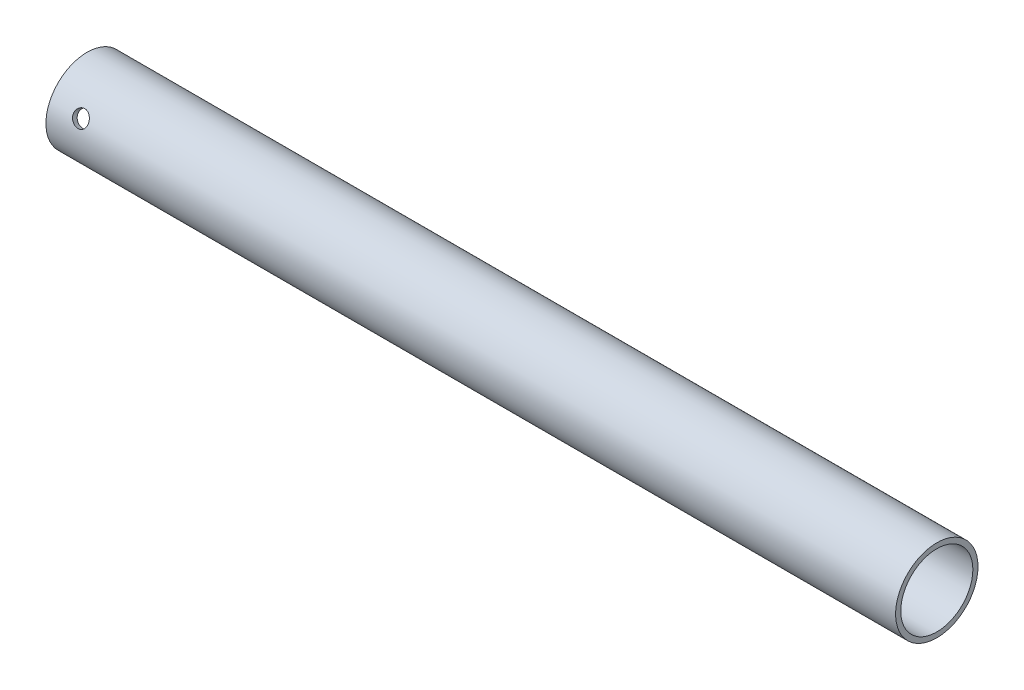
ISO-10303-21;
HEADER;
FILE_DESCRIPTION(('STEP AP214'),'2;1');
FILE_NAME('part.step','',(''),(''),'','','');
FILE_SCHEMA(('AUTOMOTIVE_DESIGN { 1 0 10303 214 1 1 1 1 }'));
ENDSEC;
DATA;
#1=APPLICATION_CONTEXT('core data for automotive mechanical design processes');
#2=APPLICATION_PROTOCOL_DEFINITION('international standard','automotive_design',2000,#1);
#3=PRODUCT_CONTEXT('',#1,'mechanical');
#4=PRODUCT('Part','Part','',(#3));
#5=PRODUCT_RELATED_PRODUCT_CATEGORY('part','',(#4));
#6=PRODUCT_DEFINITION_FORMATION('','',#4);
#7=PRODUCT_DEFINITION_CONTEXT('part definition',#1,'design');
#8=PRODUCT_DEFINITION('design','',#6,#7);
#9=PRODUCT_DEFINITION_SHAPE('','',#8);
#10=(LENGTH_UNIT() NAMED_UNIT(*) SI_UNIT(.MILLI.,.METRE.));
#11=(NAMED_UNIT(*) PLANE_ANGLE_UNIT() SI_UNIT($,.RADIAN.));
#12=(NAMED_UNIT(*) SI_UNIT($,.STERADIAN.) SOLID_ANGLE_UNIT());
#13=UNCERTAINTY_MEASURE_WITH_UNIT(LENGTH_MEASURE(1.E-05),#10,'distance_accuracy_value','');
#14=(GEOMETRIC_REPRESENTATION_CONTEXT(3) GLOBAL_UNCERTAINTY_ASSIGNED_CONTEXT((#13)) GLOBAL_UNIT_ASSIGNED_CONTEXT((#10,
#11,#12)) REPRESENTATION_CONTEXT('',''));
#15=CARTESIAN_POINT('',(0.,0.,0.));
#16=DIRECTION('',(0.,0.,1.));
#17=DIRECTION('',(1.,0.,0.));
#18=AXIS2_PLACEMENT_3D('',#15,#16,#17);
#19=CARTESIAN_POINT('',(0.,0.,0.));
#20=DIRECTION('',(1.,0.,0.));
#21=DIRECTION('',(0.,0.,-1.));
#22=AXIS2_PLACEMENT_3D('',#19,#20,#21);
#23=CYLINDRICAL_SURFACE('',#22,8.);
#24=CARTESIAN_POINT('',(6.00000000000021,-4.73293889927224,-6.44975110959761));
#25=CARTESIAN_POINT('',(5.91654279198847,-4.73293670356536,-6.44975394423419));
#26=CARTESIAN_POINT('',(5.83304405178182,-4.72720698252317,-6.45396938374698));
#27=CARTESIAN_POINT('',(5.66840103841831,-4.70440651115899,-6.47060669800228));
#28=CARTESIAN_POINT('',(5.58725882357274,-4.68732614014272,-6.48303553428556));
#29=CARTESIAN_POINT('',(5.42973492862934,-4.64222504081717,-6.5154057096328));
#30=CARTESIAN_POINT('',(5.35334889069292,-4.61421450352958,-6.53534005014052));
#31=CARTESIAN_POINT('',(5.2073464407134,-4.54786060870917,-6.58168627596715));
#32=CARTESIAN_POINT('',(5.13772950099691,-4.50951805747086,-6.6080976558134));
#33=CARTESIAN_POINT('',(5.00636980080108,-4.42281518271739,-6.66644275256281));
#34=CARTESIAN_POINT('',(4.94472351652848,-4.37434790440385,-6.698434772637));
#35=CARTESIAN_POINT('',(4.83189561040065,-4.26869189559974,-6.76625471572917));
#36=CARTESIAN_POINT('',(4.78071467557542,-4.21150259295507,-6.80208289034822));
#37=CARTESIAN_POINT('',(4.6899006233997,-4.08920330227158,-6.87630450779502));
#38=CARTESIAN_POINT('',(4.65035846648079,-4.02403628254782,-6.91471541668687));
#39=CARTESIAN_POINT('',(4.58453045772668,-3.88771533566696,-6.99226794903772));
#40=CARTESIAN_POINT('',(4.55824351600999,-3.81656190129141,-7.03140951214574));
#41=CARTESIAN_POINT('',(4.51997045138908,-3.6709983171679,-7.10847885261805));
#42=CARTESIAN_POINT('',(4.50782169407753,-3.59663562086913,-7.14641544929035));
#43=CARTESIAN_POINT('',(4.49766311229981,-3.44597163872381,-7.22027112025837));
#44=CARTESIAN_POINT('',(4.49965208386116,-3.36967051850532,-7.25619036608962));
#45=CARTESIAN_POINT('',(4.51758777114737,-3.21832575593646,-7.32456085190126));
#46=CARTESIAN_POINT('',(4.53335936943022,-3.14327833274643,-7.357049890991));
#47=CARTESIAN_POINT('',(4.57813564939545,-2.99568272204767,-7.41837420339098));
#48=CARTESIAN_POINT('',(4.60714081334602,-2.92313462572503,-7.44720934349396));
#49=CARTESIAN_POINT('',(4.67772773105852,-2.78230135720888,-7.50096781937475));
#50=CARTESIAN_POINT('',(4.71937948791271,-2.71404253304842,-7.52586817749739));
#51=CARTESIAN_POINT('',(4.81402566907737,-2.58429915522336,-7.57140228300957));
#52=CARTESIAN_POINT('',(4.8670212468878,-2.52281529143652,-7.59203559608348));
#53=CARTESIAN_POINT('',(4.98381570298375,-2.40764614162569,-7.6293490689533));
#54=CARTESIAN_POINT('',(5.04776778390229,-2.35409490186335,-7.64596375667763));
#55=CARTESIAN_POINT('',(5.18414953127884,-2.2577120085726,-7.67497737059568));
#56=CARTESIAN_POINT('',(5.25657932176485,-2.21488051190169,-7.68737623510198));
#57=CARTESIAN_POINT('',(5.40805827070288,-2.1413770156803,-7.70817573234633));
#58=CARTESIAN_POINT('',(5.48711845719086,-2.11072578100153,-7.7165695421267));
#59=CARTESIAN_POINT('',(5.64950118412342,-2.06284146749825,-7.72950880925701));
#60=CARTESIAN_POINT('',(5.732823240465,-2.04560686827817,-7.73405470266438));
#61=CARTESIAN_POINT('',(5.9000193288561,-2.02538440271331,-7.73937510637354));
#62=CARTESIAN_POINT('',(5.98386611556573,-2.02218573326198,-7.74020542402902));
#63=CARTESIAN_POINT('',(6.15090345508737,-2.02958374395865,-7.73826879419946));
#64=CARTESIAN_POINT('',(6.2340940401483,-2.04017974186624,-7.73550202461493));
#65=CARTESIAN_POINT('',(6.39675290305461,-2.07460949572077,-7.72633841028058));
#66=CARTESIAN_POINT('',(6.47624625262511,-2.09833317706915,-7.71997174085314));
#67=CARTESIAN_POINT('',(6.63005718973038,-2.15806845138347,-7.70348588657784));
#68=CARTESIAN_POINT('',(6.70437439531555,-2.1940809499915,-7.6933664251578));
#69=CARTESIAN_POINT('',(6.84666761904338,-2.27762631635789,-7.66904986300165));
#70=CARTESIAN_POINT('',(6.91456053786629,-2.32528736660282,-7.6548070419685));
#71=CARTESIAN_POINT('',(7.04121204021455,-2.43031872170758,-7.62211053765215));
#72=CARTESIAN_POINT('',(7.09996980155599,-2.48768989953044,-7.60365647571661));
#73=CARTESIAN_POINT('',(7.20748376353434,-2.61114263432655,-7.56215729468081));
#74=CARTESIAN_POINT('',(7.25609582660618,-2.67733033983387,-7.53905412262219));
#75=CARTESIAN_POINT('',(7.34092120617788,-2.81570946408062,-7.48847107999485));
#76=CARTESIAN_POINT('',(7.37713500002522,-2.88790065154611,-7.4609913779872));
#77=CARTESIAN_POINT('',(7.4359200978643,-3.03563966231636,-7.40210622595685));
#78=CARTESIAN_POINT('',(7.45856218756163,-3.11116782361979,-7.37072219461549));
#79=CARTESIAN_POINT('',(7.4897870482901,-3.26360346148095,-7.30450492677288));
#80=CARTESIAN_POINT('',(7.49837129866293,-3.34051079204405,-7.26967205361105));
#81=CARTESIAN_POINT('',(7.50118530151866,-3.49221274188924,-7.19801230574731));
#82=CARTESIAN_POINT('',(7.49563275312975,-3.567021680966,-7.16122411171047));
#83=CARTESIAN_POINT('',(7.47080757223178,-3.71362751529178,-7.08630715799654));
#84=CARTESIAN_POINT('',(7.45153507125601,-3.78542443941002,-7.04817841117467));
#85=CARTESIAN_POINT('',(7.3999087926165,-3.92399265047263,-6.97198164973479));
#86=CARTESIAN_POINT('',(7.36757818711921,-3.99077259259497,-6.93391364683718));
#87=CARTESIAN_POINT('',(7.29077954634503,-4.11783949333345,-6.85921544133708));
#88=CARTESIAN_POINT('',(7.24631069789356,-4.17812601655994,-6.8225853352514));
#89=CARTESIAN_POINT('',(7.14574854555789,-4.29167060045421,-6.75174876834537));
#90=CARTESIAN_POINT('',(7.08949796613851,-4.34481570836328,-6.71758450284534));
#91=CARTESIAN_POINT('',(6.96729543750751,-4.44190611067895,-6.65378489894142));
#92=CARTESIAN_POINT('',(6.9013412096265,-4.48584923833142,-6.62415062764003));
#93=CARTESIAN_POINT('',(6.76087354529687,-4.5639522587067,-6.57058670129395));
#94=CARTESIAN_POINT('',(6.68628656033258,-4.59801786912424,-6.54671236575887));
#95=CARTESIAN_POINT('',(6.53117421002048,-4.65504201593189,-6.50629046108281));
#96=CARTESIAN_POINT('',(6.45065453341083,-4.67801103690441,-6.48973597705864));
#97=CARTESIAN_POINT('',(6.3082477119343,-4.70771847740246,-6.468200584443));
#98=CARTESIAN_POINT('',(6.24719427623827,-4.71716388554578,-6.46130220512707));
#99=CARTESIAN_POINT('',(6.1241015315799,-4.72977482741939,-6.45207647594048));
#100=CARTESIAN_POINT('',(6.06206224949989,-4.73294053209117,-6.44974900164401));
#101=CARTESIAN_POINT('',(6.00000000000021,-4.73293889927224,-6.44975110959761));
#102=B_SPLINE_CURVE_WITH_KNOTS('',3,(#24,#25,#26,#27,#28,#29,#30,#31,#32,#33,#34,#35,#36,#37,
#38,#39,#40,#41,#42,#43,#44,#45,#46,#47,#48,#49,#50,#51,#52,#53,#54,#55,#56,#57,#58,#59,#60,#61,
#62,#63,#64,#65,#66,#67,#68,#69,#70,#71,#72,#73,#74,#75,#76,#77,#78,#79,#80,#81,#82,#83,#84,#85,
#86,#87,#88,#89,#90,#91,#92,#93,#94,#95,#96,#97,#98,#99,#100,#101),.UNSPECIFIED.,.T.,.F.,(4,2,2,
2,2,2,2,2,2,2,2,2,2,2,2,2,2,2,2,2,2,2,2,2,2,2,2,2,2,2,2,2,2,2,2,2,2,2,4),(0.,0.250144505793187,
0.500501302380396,0.750625227978438,1.00072963993909,1.25362335698692,1.50653367069315,
1.76137104348048,2.01618745939641,2.26804275460261,2.51987660200648,2.76855650598725,
3.01724547328425,3.2673369198422,3.51745380911786,3.77140614764065,4.02536220192401,
4.27974936118267,4.53410768866488,4.78463248587076,5.03514489338719,5.28358792315369,
5.53204926624318,5.78337862654144,6.03473059394678,6.28944125495871,6.54414210821706,
6.79750269418684,7.05083661667331,7.30029300570139,7.54974700322169,7.79876026530359,
8.04779021357111,8.30038464008746,8.55303847730766,8.80803001818119,9.0627801574912,
9.24880307527216,9.43482092920426),.UNSPECIFIED.);
#103=CARTESIAN_POINT('',(6.00000000000021,-4.73293889927224,-6.44975110959761));
#104=VERTEX_POINT('',#103);
#105=EDGE_CURVE('E74',#104,#104,#102,.T.);
#106=ORIENTED_EDGE('',*,*,#105,.F.);
#107=EDGE_LOOP('',(#106));
#108=FACE_BOUND('',#107,.T.);
#109=CARTESIAN_POINT('',(6.00000000000022,2.02439330337612,7.73962736527063));
#110=CARTESIAN_POINT('',(6.08345720801196,2.02439688800807,7.7396274471672));
#111=CARTESIAN_POINT('',(6.16695594821861,2.03128092762491,7.73783590256517));
#112=CARTESIAN_POINT('',(6.33159896158213,2.05856820133278,7.73062019652554));
#113=CARTESIAN_POINT('',(6.4127411764277,2.07898290383587,7.72519295347584));
#114=CARTESIAN_POINT('',(6.5702650713711,2.13254021942243,7.71057955689787));
#115=CARTESIAN_POINT('',(6.64665110930751,2.16567097589517,7.70139690444004));
#116=CARTESIAN_POINT('',(6.79265355928703,2.24347397071442,7.67909206184102));
#117=CARTESIAN_POINT('',(6.86227049900353,2.28814530844045,7.6659701791022));
#118=CARTESIAN_POINT('',(6.99363019919936,2.38808930052141,7.63542943169589));
#119=CARTESIAN_POINT('',(7.05527648347195,2.44347463051732,7.61796427676404));
#120=CARTESIAN_POINT('',(7.16810438959979,2.5627202685297,7.57868050540153));
#121=CARTESIAN_POINT('',(7.21928532442502,2.6265811324951,7.55686160334143));
#122=CARTESIAN_POINT('',(7.31009937660074,2.76128664904322,7.50869118908526));
#123=CARTESIAN_POINT('',(7.34964153351964,2.83218080725976,7.4823064072529));
#124=CARTESIAN_POINT('',(7.41546954227375,2.97830980619766,7.42534930495711));
#125=CARTESIAN_POINT('',(7.44175648399044,3.0535442894781,7.39477732903962));
#126=CARTESIAN_POINT('',(7.48002954861136,3.20512351589156,7.33033993008827));
#127=CARTESIAN_POINT('',(7.49217830592291,3.28144519758691,7.29651690729174));
#128=CARTESIAN_POINT('',(7.50233688770062,3.43374404318924,7.22609420301094));
#129=CARTESIAN_POINT('',(7.50034791613928,3.5097212358816,7.18949475823006));
#130=CARTESIAN_POINT('',(7.48241222885307,3.65819059557423,7.11508636005078));
#131=CARTESIAN_POINT('',(7.46664063057021,3.73071449182107,7.07729829498236));
#132=CARTESIAN_POINT('',(7.42186435060498,3.87135039534218,7.0013596471825));
#133=CARTESIAN_POINT('',(7.39285918665442,3.9394622417257,6.96320905128905));
#134=CARTESIAN_POINT('',(7.32227226894192,4.06996210919647,6.88775199171158));
#135=CARTESIAN_POINT('',(7.28062051208772,4.13231568460117,6.85045150184007));
#136=CARTESIAN_POINT('',(7.18597433092307,4.24944071855494,6.77842077731517));
#137=CARTESIAN_POINT('',(7.13297875311264,4.30421140510218,6.74369080452929));
#138=CARTESIAN_POINT('',(7.01618429701669,4.40576843084551,6.67779392411811));
#139=CARTESIAN_POINT('',(6.95223221609814,4.45241945368148,6.64668982154919));
#140=CARTESIAN_POINT('',(6.81585046872159,4.53569224268836,6.59014696592006));
#141=CARTESIAN_POINT('',(6.74342067823558,4.57231386210396,6.56470829576034));
#142=CARTESIAN_POINT('',(6.59194172929755,4.63478919500224,6.52075131882112));
#143=CARTESIAN_POINT('',(6.51288154280957,4.66062452381412,6.50224483306222));
#144=CARTESIAN_POINT('',(6.35049881587701,4.7008503420867,6.47322388101287));
#145=CARTESIAN_POINT('',(6.26717675953543,4.71524212835275,6.46270850915924));
#146=CARTESIAN_POINT('',(6.09998067114434,4.73211839059227,6.45036158314611));
#147=CARTESIAN_POINT('',(6.0161338844347,4.73477905708706,6.44840154042429));
#148=CARTESIAN_POINT('',(5.84909654491307,4.72861275442688,6.45292457136249));
#149=CARTESIAN_POINT('',(5.76590595985213,4.71978635338578,6.45940722747347));
#150=CARTESIAN_POINT('',(5.60324709694583,4.69097187652095,6.48036207658194));
#151=CARTESIAN_POINT('',(5.52375374737532,4.67107660489194,6.4947678290137));
#152=CARTESIAN_POINT('',(5.36994281027006,4.62062798786718,6.53075426296987));
#153=CARTESIAN_POINT('',(5.29562560468489,4.59007385694773,6.55233547329698));
#154=CARTESIAN_POINT('',(5.15333238095705,4.5185388629093,6.60187200591998));
#155=CARTESIAN_POINT('',(5.08543946213414,4.47744171398628,6.62989802975196));
#156=CARTESIAN_POINT('',(4.95878795978588,4.38585874581796,6.69083411832953));
#157=CARTESIAN_POINT('',(4.90003019844444,4.33537208239313,6.72374462216845));
#158=CARTESIAN_POINT('',(4.79251623646609,4.22534447347836,6.79343454275801));
#159=CARTESIAN_POINT('',(4.74390417339425,4.16569155477132,6.83025978151113));
#160=CARTESIAN_POINT('',(4.65907879382255,4.03920379092907,6.9058128875156));
#161=CARTESIAN_POINT('',(4.62286499997521,3.97236922242576,6.94454068145074));
#162=CARTESIAN_POINT('',(4.56407990213614,3.83353664176246,7.02212799342493));
#163=CARTESIAN_POINT('',(4.54143781243881,3.76156765092481,7.06098574594515));
#164=CARTESIAN_POINT('',(4.51021295171033,3.61408244938435,7.1375981834292));
#165=CARTESIAN_POINT('',(4.50162870133751,3.53856661278545,7.17535298404869));
#166=CARTESIAN_POINT('',(4.49881469848177,3.38731842666378,7.24796556729454));
#167=CARTESIAN_POINT('',(4.50436724687069,3.31160708250177,7.28285884675441));
#168=CARTESIAN_POINT('',(4.52919242776865,3.16104201589046,7.34946200980591));
#169=CARTESIAN_POINT('',(4.54846492874443,3.08618828522621,7.38117192391316));
#170=CARTESIAN_POINT('',(4.60009120738393,2.93969548796048,7.44072824952415));
#171=CARTESIAN_POINT('',(4.63242181288123,2.86805097535126,7.46858138808092));
#172=CARTESIAN_POINT('',(4.7092204536554,2.72997056154445,7.52015287721163));
#173=CARTESIAN_POINT('',(4.75368930210687,2.66353500969358,7.54387095059156));
#174=CARTESIAN_POINT('',(4.85425145444254,2.53697539993205,7.58737792612151));
#175=CARTESIAN_POINT('',(4.91050203386192,2.47695529226579,7.60710572902892));
#176=CARTESIAN_POINT('',(5.03270456249292,2.36622959900129,7.64227327843477));
#177=CARTESIAN_POINT('',(5.09865879037394,2.3155262075172,7.65771201528259));
#178=CARTESIAN_POINT('',(5.23912645470356,2.2247144361632,7.68458948132572));
#179=CARTESIAN_POINT('',(5.31371343966786,2.18470842838921,7.69598987835165));
#180=CARTESIAN_POINT('',(5.46882578997996,2.11738519900045,7.71478526293002));
#181=CARTESIAN_POINT('',(5.5493454665896,2.09005600071383,7.72218403220286));
#182=CARTESIAN_POINT('',(5.69175228806613,2.05461271821386,7.73167502170255));
#183=CARTESIAN_POINT('',(5.75280572376216,2.0433038209064,7.7346603548279));
#184=CARTESIAN_POINT('',(5.87589846842053,2.02819288281714,7.73863646901471));
#185=CARTESIAN_POINT('',(5.93793775050054,2.02439063769478,7.73962730436893));
#186=CARTESIAN_POINT('',(6.00000000000022,2.02439330337612,7.73962736527063));
#187=B_SPLINE_CURVE_WITH_KNOTS('',3,(#109,#110,#111,#112,#113,#114,#115,#116,#117,#118,#119,
#120,#121,#122,#123,#124,#125,#126,#127,#128,#129,#130,#131,#132,#133,#134,#135,#136,#137,#138,
#139,#140,#141,#142,#143,#144,#145,#146,#147,#148,#149,#150,#151,#152,#153,#154,#155,#156,#157,
#158,#159,#160,#161,#162,#163,#164,#165,#166,#167,#168,#169,#170,#171,#172,#173,#174,#175,#176,
#177,#178,#179,#180,#181,#182,#183,#184,#185,#186),.UNSPECIFIED.,.T.,.F.,(4,2,2,2,2,2,2,2,2,2,2,
2,2,2,2,2,2,2,2,2,2,2,2,2,2,2,2,2,2,2,2,2,2,2,2,2,2,2,4),(0.,0.250144505793187,
0.500501302380396,0.750625227978437,1.00072963993908,1.25362335698692,1.50653367069315,
1.76137104348048,2.01618745939641,2.26804275460261,2.51987660200649,2.76855650598725,
3.01724547328425,3.2673369198422,3.51745380911786,3.77140614764065,4.02536220192401,
4.27974936118267,4.53410768866489,4.78463248587076,5.03514489338719,5.28358792315369,
5.53204926624318,5.78337862654144,6.03473059394678,6.28944125495872,6.54414210821706,
6.79750269418684,7.05083661667331,7.30029300570139,7.54974700322169,7.79876026530359,
8.04779021357111,8.30038464008746,8.55303847730766,8.80803001818119,9.0627801574912,
9.24880307527216,9.43482092920426),.UNSPECIFIED.);
#188=CARTESIAN_POINT('',(6.00000000000022,2.02439330337612,7.73962736527063));
#189=VERTEX_POINT('',#188);
#190=EDGE_CURVE('E92',#189,#189,#187,.T.);
#191=ORIENTED_EDGE('',*,*,#190,.F.);
#192=EDGE_LOOP('',(#191));
#193=FACE_BOUND('',#192,.T.);
#194=CARTESIAN_POINT('',(165.,0.,0.));
#195=DIRECTION('',(1.,0.,0.));
#196=DIRECTION('',(0.,0.,-1.));
#197=AXIS2_PLACEMENT_3D('',#194,#195,#196);
#198=CIRCLE('',#197,8.);
#199=CARTESIAN_POINT('',(165.,0.,-8.));
#200=VERTEX_POINT('',#199);
#201=EDGE_CURVE('E66',#200,#200,#198,.T.);
#202=ORIENTED_EDGE('',*,*,#201,.F.);
#203=EDGE_LOOP('',(#202));
#204=FACE_BOUND('',#203,.T.);
#205=CARTESIAN_POINT('',(0.,0.,0.));
#206=DIRECTION('',(1.,0.,0.));
#207=DIRECTION('',(0.,0.,-1.));
#208=AXIS2_PLACEMENT_3D('',#205,#206,#207);
#209=CIRCLE('',#208,8.);
#210=CARTESIAN_POINT('',(0.,0.,-8.));
#211=VERTEX_POINT('',#210);
#212=EDGE_CURVE('E72',#211,#211,#209,.T.);
#213=ORIENTED_EDGE('',*,*,#212,.T.);
#214=EDGE_LOOP('',(#213));
#215=FACE_BOUND('',#214,.T.);
#216=ADVANCED_FACE('F48',(#108,#193,#204,#215),#23,.T.);
#217=CARTESIAN_POINT('',(0.,0.,0.));
#218=DIRECTION('',(1.,0.,0.));
#219=DIRECTION('',(0.,0.,-1.));
#220=AXIS2_PLACEMENT_3D('',#217,#218,#219);
#221=PLANE('',#220);
#222=CARTESIAN_POINT('',(0.,0.,0.));
#223=DIRECTION('',(1.,0.,0.));
#224=DIRECTION('',(0.,0.,-1.));
#225=AXIS2_PLACEMENT_3D('',#222,#223,#224);
#226=CIRCLE('',#225,7.);
#227=CARTESIAN_POINT('',(0.,0.,-7.));
#228=VERTEX_POINT('',#227);
#229=EDGE_CURVE('E61',#228,#228,#226,.F.);
#230=ORIENTED_EDGE('',*,*,#229,.F.);
#231=EDGE_LOOP('',(#230));
#232=FACE_BOUND('',#231,.T.);
#233=ORIENTED_EDGE('',*,*,#212,.F.);
#234=EDGE_LOOP('',(#233));
#235=FACE_BOUND('',#234,.T.);
#236=ADVANCED_FACE('F107',(#232,#235),#221,.F.);
#237=CARTESIAN_POINT('',(165.,0.,0.));
#238=DIRECTION('',(1.,0.,0.));
#239=DIRECTION('',(0.,0.,-1.));
#240=AXIS2_PLACEMENT_3D('',#237,#238,#239);
#241=PLANE('',#240);
#242=CARTESIAN_POINT('',(165.,0.,0.));
#243=DIRECTION('',(1.,0.,0.));
#244=DIRECTION('',(0.,0.,-1.));
#245=AXIS2_PLACEMENT_3D('',#242,#243,#244);
#246=CIRCLE('',#245,7.);
#247=CARTESIAN_POINT('',(165.,0.,-7.));
#248=VERTEX_POINT('',#247);
#249=EDGE_CURVE('E11',#248,#248,#246,.F.);
#250=ORIENTED_EDGE('',*,*,#249,.T.);
#251=EDGE_LOOP('',(#250));
#252=FACE_BOUND('',#251,.T.);
#253=ORIENTED_EDGE('',*,*,#201,.T.);
#254=EDGE_LOOP('',(#253));
#255=FACE_BOUND('',#254,.T.);
#256=ADVANCED_FACE('F115',(#252,#255),#241,.T.);
#257=CARTESIAN_POINT('',(0.,0.,0.));
#258=DIRECTION('',(1.,0.,0.));
#259=DIRECTION('',(0.,0.,-1.));
#260=AXIS2_PLACEMENT_3D('',#257,#258,#259);
#261=CYLINDRICAL_SURFACE('',#260,7.);
#262=CARTESIAN_POINT('',(6.00000000000021,-4.29407154944811,-5.5281958655804));
#263=CARTESIAN_POINT('',(6.08321115248217,-4.29406963761578,-5.52819863682031));
#264=CARTESIAN_POINT('',(6.16645777394234,-4.28845911161168,-5.53256943928411));
#265=CARTESIAN_POINT('',(6.33058667224222,-4.26613264423861,-5.54980214263843));
#266=CARTESIAN_POINT('',(6.41146714867642,-4.24940846471799,-5.56267034229927));
#267=CARTESIAN_POINT('',(6.56846574957442,-4.20524062075699,-5.59613375372344));
#268=CARTESIAN_POINT('',(6.64458887812169,-4.17780844757901,-5.6167206812172));
#269=CARTESIAN_POINT('',(6.79011527394483,-4.11279149676773,-5.66450055427836));
#270=CARTESIAN_POINT('',(6.8595187370293,-4.07520701508998,-5.69169330727337));
#271=CARTESIAN_POINT('',(6.99076296148234,-3.990001503207,-5.7517507508143));
#272=CARTESIAN_POINT('',(7.05247887624018,-3.94224228931959,-5.78469227056245));
#273=CARTESIAN_POINT('',(7.16550355440601,-3.8379794646106,-5.85438627807217));
#274=CARTESIAN_POINT('',(7.21681152886029,-3.78147519145872,-5.89113905441977));
#275=CARTESIAN_POINT('',(7.30805544449165,-3.66029712831063,-5.96719240881621));
#276=CARTESIAN_POINT('',(7.34787165577084,-3.59554679505758,-6.0065149178673));
#277=CARTESIAN_POINT('',(7.41422769144651,-3.4598575198465,-6.08568380513812));
#278=CARTESIAN_POINT('',(7.4407689447865,-3.38891924493692,-6.12553012649954));
#279=CARTESIAN_POINT('',(7.47942997093156,-3.24381061428116,-6.20357755639398));
#280=CARTESIAN_POINT('',(7.49176092855265,-3.16970502941725,-6.24179440509746));
#281=CARTESIAN_POINT('',(7.50231127731348,-3.01935731529709,-6.3158927742373));
#282=CARTESIAN_POINT('',(7.50053222056097,-2.94311542195507,-6.35177455109481));
#283=CARTESIAN_POINT('',(7.48307103533663,-2.79200051258896,-6.41961718687827));
#284=CARTESIAN_POINT('',(7.4676164997103,-2.71712548066886,-6.45163252184036));
#285=CARTESIAN_POINT('',(7.42360531814835,-2.56969788145043,-6.5117581896562));
#286=CARTESIAN_POINT('',(7.39504809570048,-2.49714541649427,-6.53986835061316));
#287=CARTESIAN_POINT('',(7.3254385411117,-2.35602453148035,-6.59202952518716));
#288=CARTESIAN_POINT('',(7.28429923279587,-2.28748793132787,-6.61605041226119));
#289=CARTESIAN_POINT('',(7.19075803183662,-2.1570257237934,-6.65972822301624));
#290=CARTESIAN_POINT('',(7.13835466269992,-2.0951009846885,-6.67938457390643));
#291=CARTESIAN_POINT('',(7.02253145547235,-1.97862068334895,-6.71482288610759));
#292=CARTESIAN_POINT('',(6.95891242064318,-1.92423708552005,-6.73051958656552));
#293=CARTESIAN_POINT('',(6.82311671493171,-1.8261629969426,-6.75779013797819));
#294=CARTESIAN_POINT('',(6.75093983059496,-1.78247277299721,-6.76936388606723));
#295=CARTESIAN_POINT('',(6.59977549893645,-1.70725370956059,-6.78872628656748));
#296=CARTESIAN_POINT('',(6.52076987614777,-1.67575862931071,-6.79650444708593));
#297=CARTESIAN_POINT('',(6.35836723405377,-1.62634050426902,-6.80849982811463));
#298=CARTESIAN_POINT('',(6.27497088255702,-1.60841540189074,-6.81271758849184));
#299=CARTESIAN_POINT('',(6.1079042473505,-1.58708932852227,-6.81771708962416));
#300=CARTESIAN_POINT('',(6.02427132492291,-1.58341074755836,-6.81856451420917));
#301=CARTESIAN_POINT('',(5.85758600681852,-1.58996167749831,-6.81703989032261));
#302=CARTESIAN_POINT('',(5.77453357334666,-1.60019027427921,-6.81466805345407));
#303=CARTESIAN_POINT('',(5.61232956501945,-1.6339409724423,-6.80665329353585));
#304=CARTESIAN_POINT('',(5.53314456740326,-1.65731189809604,-6.80104755132789));
#305=CARTESIAN_POINT('',(5.37983766246729,-1.71634238871848,-6.78638990982007));
#306=CARTESIAN_POINT('',(5.30571622436602,-1.75200309068257,-6.77733769165948));
#307=CARTESIAN_POINT('',(5.1634303152413,-1.83495687113557,-6.75535303960489));
#308=CARTESIAN_POINT('',(5.09537041798803,-1.8824145248256,-6.74236508373704));
#309=CARTESIAN_POINT('',(4.96824165412642,-1.98707225207752,-6.71226505179968));
#310=CARTESIAN_POINT('',(4.90917385855175,-2.04427348446359,-6.695152485081));
#311=CARTESIAN_POINT('',(4.80062969705546,-2.16768522874955,-6.65622964615445));
#312=CARTESIAN_POINT('',(4.7513430838432,-2.2340381670966,-6.63434106830269));
#313=CARTESIAN_POINT('',(4.66511459064917,-2.37282066174774,-6.5859785849325));
#314=CARTESIAN_POINT('',(4.62817214702738,-2.44524994041459,-6.55950488885635));
#315=CARTESIAN_POINT('',(4.56794794536174,-2.59342688377301,-6.50233786720297));
#316=CARTESIAN_POINT('',(4.54458169625394,-2.66915080158015,-6.4716721398));
#317=CARTESIAN_POINT('',(4.5119082942679,-2.82196878527825,-6.40651118259444));
#318=CARTESIAN_POINT('',(4.5025991840263,-2.89906265889911,-6.37201648666852));
#319=CARTESIAN_POINT('',(4.49838934758835,-3.05072592683352,-6.30078977460731));
#320=CARTESIAN_POINT('',(4.50320484139559,-3.1253149994696,-6.26411613171272));
#321=CARTESIAN_POINT('',(4.52647476351924,-3.271437718753,-6.18905834960465));
#322=CARTESIAN_POINT('',(4.54492896557853,-3.34297141606617,-6.15067423877661));
#323=CARTESIAN_POINT('',(4.5948188062497,-3.48090643309498,-6.0736740514208));
#324=CARTESIAN_POINT('',(4.62621568938577,-3.54732237858207,-6.03505900374294));
#325=CARTESIAN_POINT('',(4.70106127116934,-3.67370299035035,-5.95897253800113));
#326=CARTESIAN_POINT('',(4.74451108830624,-3.73366705719236,-5.92150122643213));
#327=CARTESIAN_POINT('',(4.84316231874289,-3.8468965810612,-5.84859038891321));
#328=CARTESIAN_POINT('',(4.89856415832153,-3.90001943956649,-5.81320056761455));
#329=CARTESIAN_POINT('',(5.01914061025056,-3.99718046110107,-5.74682684295291));
#330=CARTESIAN_POINT('',(5.08431756335582,-4.04121644216388,-5.71584399835914));
#331=CARTESIAN_POINT('',(5.22359049318589,-4.11981378409607,-5.65946198390765));
#332=CARTESIAN_POINT('',(5.29778935828724,-4.15424752630391,-5.63413883725905));
#333=CARTESIAN_POINT('',(5.45234372092346,-4.21214124661777,-5.59099095847974));
#334=CARTESIAN_POINT('',(5.53269384525328,-4.23561067772119,-5.57315976841896));
#335=CARTESIAN_POINT('',(5.67762613118607,-4.26686559128959,-5.5492468835222));
#336=CARTESIAN_POINT('',(5.74141167570804,-4.27705405726572,-5.54137912342322));
#337=CARTESIAN_POINT('',(5.87012431157754,-4.29065763031694,-5.53085264994583));
#338=CARTESIAN_POINT('',(5.93505135150853,-4.29407304168711,-5.52819370254959));
#339=CARTESIAN_POINT('',(6.00000000000021,-4.29407154944811,-5.5281958655804));
#340=B_SPLINE_CURVE_WITH_KNOTS('',3,(#262,#263,#264,#265,#266,#267,#268,#269,#270,#271,#272,
#273,#274,#275,#276,#277,#278,#279,#280,#281,#282,#283,#284,#285,#286,#287,#288,#289,#290,#291,
#292,#293,#294,#295,#296,#297,#298,#299,#300,#301,#302,#303,#304,#305,#306,#307,#308,#309,#310,
#311,#312,#313,#314,#315,#316,#317,#318,#319,#320,#321,#322,#323,#324,#325,#326,#327,#328,#329,
#330,#331,#332,#333,#334,#335,#336,#337,#338,#339),.UNSPECIFIED.,.T.,.F.,(4,2,2,2,2,2,2,2,2,2,2,
2,2,2,2,2,2,2,2,2,2,2,2,2,2,2,2,2,2,2,2,2,2,2,2,2,2,2,4),(0.,0.249395482027529,
0.498976038479967,0.748289491152764,0.997595676735289,1.25053229582693,1.50348808112879,
1.75899134820279,2.01446710646268,2.26609508151929,2.51769537777241,2.76518557667372,
3.01268666607584,3.26193888143437,3.51122378872315,3.76548960779295,4.01976177023093,
4.27473287411782,4.5296653095384,4.77960433192524,5.02952692653918,5.27663180749376,
5.52375955563151,5.77455010216319,6.02537049659078,6.28066214683211,6.53594213875542,
6.78961589824376,7.0432543320854,7.29183199644128,7.54040553715101,7.78824009619485,
8.03609766151367,8.28848914160966,8.54094115631234,8.79660380167249,9.05204561611688,
9.24671456122273,9.44137476018023),.UNSPECIFIED.);
#341=CARTESIAN_POINT('',(6.00000000000021,-4.29407154944811,-5.5281958655804));
#342=VERTEX_POINT('',#341);
#343=EDGE_CURVE('E52',#342,#342,#340,.T.);
#344=ORIENTED_EDGE('',*,*,#343,.F.);
#345=EDGE_LOOP('',(#344));
#346=FACE_BOUND('',#345,.T.);
#347=CARTESIAN_POINT('',(6.00000000000022,1.58552595355199,6.81807212125342));
#348=CARTESIAN_POINT('',(5.91678884751827,1.58552931004645,6.81807238358609));
#349=CARTESIAN_POINT('',(5.8335422260581,1.59245884444504,6.81647129981595));
#350=CARTESIAN_POINT('',(5.66941332775821,1.6199096125744,6.80999885519531));
#351=CARTESIAN_POINT('',(5.58853285132401,1.64044092878219,6.80512506837964));
#352=CARTESIAN_POINT('',(5.43153425042601,1.69425880206875,6.79192526310765));
#353=CARTESIAN_POINT('',(5.35541112187875,1.72753168483681,6.78360294484874));
#354=CARTESIAN_POINT('',(5.2098847260556,1.80560509093282,6.76323965869185));
#355=CARTESIAN_POINT('',(5.14048126297114,1.85040527822012,6.75119879919368));
#356=CARTESIAN_POINT('',(5.00923703851809,1.95073494967062,6.72289980969675));
#357=CARTESIAN_POINT('',(4.94752112376025,2.00641117528507,6.70658282052014));
#358=CARTESIAN_POINT('',(4.83449644559443,2.12623370708531,6.66956185116434));
#359=CARTESIAN_POINT('',(4.78318847114014,2.19038065476969,6.64885753865567));
#360=CARTESIAN_POINT('',(4.69194455550878,2.32580160942437,6.60271210828943));
#361=CARTESIAN_POINT('',(4.6521283442296,2.39714088607287,6.57722538661472));
#362=CARTESIAN_POINT('',(4.58577230855392,2.54412665867619,6.52177744011338));
#363=CARTESIAN_POINT('',(4.55923105521394,2.61977269006637,6.49181669733054));
#364=CARTESIAN_POINT('',(4.52057002906888,2.77182453695394,6.4283489743369));
#365=CARTESIAN_POINT('',(4.50823907144779,2.84820174952512,6.39490220120848));
#366=CARTESIAN_POINT('',(4.49768872268696,3.00048968543612,6.32487800520235));
#367=CARTESIAN_POINT('',(4.49946777943946,3.07640045916511,6.28830092709741));
#368=CARTESIAN_POINT('',(4.5169289646638,3.22431513936211,6.21373829272204));
#369=CARTESIAN_POINT('',(4.53238350029014,3.29636261023729,6.17578550602251));
#370=CARTESIAN_POINT('',(4.57639468185208,3.43596202300846,6.09922182732592));
#371=CARTESIAN_POINT('',(4.60495190429996,3.50351376694474,6.06061090644323));
#372=CARTESIAN_POINT('',(4.67456145888874,3.63295480552608,5.98392381593228));
#373=CARTESIAN_POINT('',(4.71570076720456,3.69480065550688,5.94585336260642));
#374=CARTESIAN_POINT('',(4.80924196816382,3.8109375656226,5.87209458783422));
#375=CARTESIAN_POINT('',(4.86164533730052,3.86522763380706,5.83640657948331));
#376=CARTESIAN_POINT('',(4.97746854452808,3.96615521191728,5.76830989418495));
#377=CARTESIAN_POINT('',(5.04108757935725,4.0126181432582,5.73598098870872));
#378=CARTESIAN_POINT('',(5.17688328506873,4.09560357291514,5.67702652925653));
#379=CARTESIAN_POINT('',(5.24906016940547,4.1321258232105,5.65040111758665));
#380=CARTESIAN_POINT('',(5.40022450106398,4.19456670192344,5.60420645639111));
#381=CARTESIAN_POINT('',(5.47923012385266,4.2204559072262,5.58465680396993));
#382=CARTESIAN_POINT('',(5.64163276594666,4.26091563253032,5.55385013461128));
#383=CARTESIAN_POINT('',(5.72502911744342,4.27548786850802,5.54259186047703));
#384=CARTESIAN_POINT('',(5.89209575264994,4.29281056185878,5.52918586510314));
#385=CARTESIAN_POINT('',(5.97572867507753,4.29578698403212,5.52686401295853));
#386=CARTESIAN_POINT('',(6.14241399318192,4.290474442979,5.53098906673183));
#387=CARTESIAN_POINT('',(6.22546642665377,4.28218622018105,5.53743539631451));
#388=CARTESIAN_POINT('',(6.38767043498098,4.25469167452876,5.55858713294338));
#389=CARTESIAN_POINT('',(6.46685543259718,4.23560949962892,5.57319860489889));
#390=CARTESIAN_POINT('',(6.62016233753314,4.18702446644168,5.60979013162152));
#391=CARTESIAN_POINT('',(6.69428377563441,4.15752064398355,5.63177086815507));
#392=CARTESIAN_POINT('',(6.83656968475914,4.08816894665866,5.6823178432927));
#393=CARTESIAN_POINT('',(6.9046295820124,4.04817423893799,5.71097686012381));
#394=CARTESIAN_POINT('',(7.03175834587401,3.95884259445662,5.77325935437719));
#395=CARTESIAN_POINT('',(7.09082614144868,3.90950454639484,5.80688342223996));
#396=CARTESIAN_POINT('',(7.19937030294498,3.80150298087194,5.87816531238329));
#397=CARTESIAN_POINT('',(7.24865691615723,3.74268890159529,5.91588435726117));
#398=CARTESIAN_POINT('',(7.33488540935127,3.61767089236926,5.99315018404434));
#399=CARTESIAN_POINT('',(7.37182785297305,3.55146730001236,6.03269688240432));
#400=CARTESIAN_POINT('',(7.4320520546387,3.41369261707469,6.11170708205719));
#401=CARTESIAN_POINT('',(7.4554183037465,3.34215792000476,6.15116954118393));
#402=CARTESIAN_POINT('',(7.48809170573254,3.19525183043412,6.22874458441665));
#403=CARTESIAN_POINT('',(7.49740081597413,3.1198809736043,6.26685735573584));
#404=CARTESIAN_POINT('',(7.50161065241208,2.96899336584904,6.33971283718709));
#405=CARTESIAN_POINT('',(7.49679515860484,2.89350953178839,6.37450761603929));
#406=CARTESIAN_POINT('',(7.47352523648119,2.74313962287004,6.44064694048131));
#407=CARTESIAN_POINT('',(7.4550710344219,2.6682535381169,6.47199154329735));
#408=CARTESIAN_POINT('',(7.40518119375073,2.5215360646511,6.53054989671837));
#409=CARTESIAN_POINT('',(7.37378431061466,2.44969625651329,6.5577756508646));
#410=CARTESIAN_POINT('',(7.2989387288311,2.31097057980273,6.6079393421283));
#411=CARTESIAN_POINT('',(7.25548891169419,2.2440851717191,6.63087688097668));
#412=CARTESIAN_POINT('',(7.15683768125754,2.11611372275912,6.67283189920283));
#413=CARTESIAN_POINT('',(7.10143584167891,2.05515614704879,6.69176999601438));
#414=CARTESIAN_POINT('',(6.98085938974987,1.94238746088057,6.72536997891612));
#415=CARTESIAN_POINT('',(6.91568243664461,1.89057854765498,6.740030838293));
#416=CARTESIAN_POINT('',(6.77640950681455,1.79726732591301,6.76551592431275));
#417=CARTESIAN_POINT('',(6.7022106417132,1.75590447426926,6.77628898620433));
#418=CARTESIAN_POINT('',(6.54765627907697,1.68591679912444,6.79404138386652));
#419=CARTESIAN_POINT('',(6.46730615474715,1.65728100389666,6.80102398846473));
#420=CARTESIAN_POINT('',(6.32237386881436,1.6190165679067,6.81021793346259));
#421=CARTESIAN_POINT('',(6.2585883242924,1.60648673958448,6.81316918576246));
#422=CARTESIAN_POINT('',(6.1298756884229,1.58974030922488,6.81709613290259));
#423=CARTESIAN_POINT('',(6.0649486484919,1.58552333371352,6.81807191649537));
#424=CARTESIAN_POINT('',(6.00000000000022,1.58552595355199,6.81807212125342));
#425=B_SPLINE_CURVE_WITH_KNOTS('',3,(#347,#348,#349,#350,#351,#352,#353,#354,#355,#356,#357,
#358,#359,#360,#361,#362,#363,#364,#365,#366,#367,#368,#369,#370,#371,#372,#373,#374,#375,#376,
#377,#378,#379,#380,#381,#382,#383,#384,#385,#386,#387,#388,#389,#390,#391,#392,#393,#394,#395,
#396,#397,#398,#399,#400,#401,#402,#403,#404,#405,#406,#407,#408,#409,#410,#411,#412,#413,#414,
#415,#416,#417,#418,#419,#420,#421,#422,#423,#424),.UNSPECIFIED.,.T.,.F.,(4,2,2,2,2,2,2,2,2,2,2,
2,2,2,2,2,2,2,2,2,2,2,2,2,2,2,2,2,2,2,2,2,2,2,2,2,2,2,4),(0.,0.249395482027529,
0.498976038479967,0.748289491152764,0.997595676735288,1.25053229582693,1.50348808112879,
1.75899134820279,2.01446710646268,2.26609508151929,2.51769537777241,2.76518557667372,
3.01268666607584,3.26193888143437,3.51122378872315,3.76548960779295,4.01976177023093,
4.27473287411782,4.5296653095384,4.77960433192524,5.02952692653917,5.27663180749375,
5.5237595556315,5.77455010216318,6.02537049659078,6.28066214683211,6.53594213875542,
6.78961589824376,7.0432543320854,7.29183199644128,7.54040553715101,7.78824009619484,
8.03609766151367,8.28848914160966,8.54094115631234,8.79660380167249,9.05204561611688,
9.24671456122273,9.44137476018023),.UNSPECIFIED.);
#426=CARTESIAN_POINT('',(6.00000000000022,1.58552595355199,6.81807212125342));
#427=VERTEX_POINT('',#426);
#428=EDGE_CURVE('E75',#427,#427,#425,.T.);
#429=ORIENTED_EDGE('',*,*,#428,.F.);
#430=EDGE_LOOP('',(#429));
#431=FACE_BOUND('',#430,.T.);
#432=ORIENTED_EDGE('',*,*,#249,.F.);
#433=EDGE_LOOP('',(#432));
#434=FACE_BOUND('',#433,.T.);
#435=ORIENTED_EDGE('',*,*,#229,.T.);
#436=EDGE_LOOP('',(#435));
#437=FACE_BOUND('',#436,.T.);
#438=ADVANCED_FACE('F80',(#346,#431,#434,#437),#261,.F.);
#439=CARTESIAN_POINT('',(6.00000000000021,-3.89112670461436,-8.1707792142888));
#440=DIRECTION('',(0.,0.429958751891068,0.902848531965509));
#441=DIRECTION('',(0.,-0.902848531965509,0.429958751891068));
#442=AXIS2_PLACEMENT_3D('',#439,#440,#441);
#443=CYLINDRICAL_SURFACE('',#442,1.5);
#444=ORIENTED_EDGE('',*,*,#190,.T.);
#445=EDGE_LOOP('',(#444));
#446=FACE_BOUND('',#445,.T.);
#447=ORIENTED_EDGE('',*,*,#428,.T.);
#448=EDGE_LOOP('',(#447));
#449=FACE_BOUND('',#448,.T.);
#450=ADVANCED_FACE('F83',(#446,#449),#443,.F.);
#451=ORIENTED_EDGE('',*,*,#105,.T.);
#452=EDGE_LOOP('',(#451));
#453=FACE_BOUND('',#452,.T.);
#454=ORIENTED_EDGE('',*,*,#343,.T.);
#455=EDGE_LOOP('',(#454));
#456=FACE_BOUND('',#455,.T.);
#457=ADVANCED_FACE('F86',(#453,#456),#443,.F.);
#458=CLOSED_SHELL('',(#216,#236,#256,#438,#450,#457));
#459=MANIFOLD_SOLID_BREP('B2',#458);
#460=ADVANCED_BREP_SHAPE_REPRESENTATION('',(#18,#459),#14);
#461=SHAPE_DEFINITION_REPRESENTATION(#9,#460);
ENDSEC;
END-ISO-10303-21;
